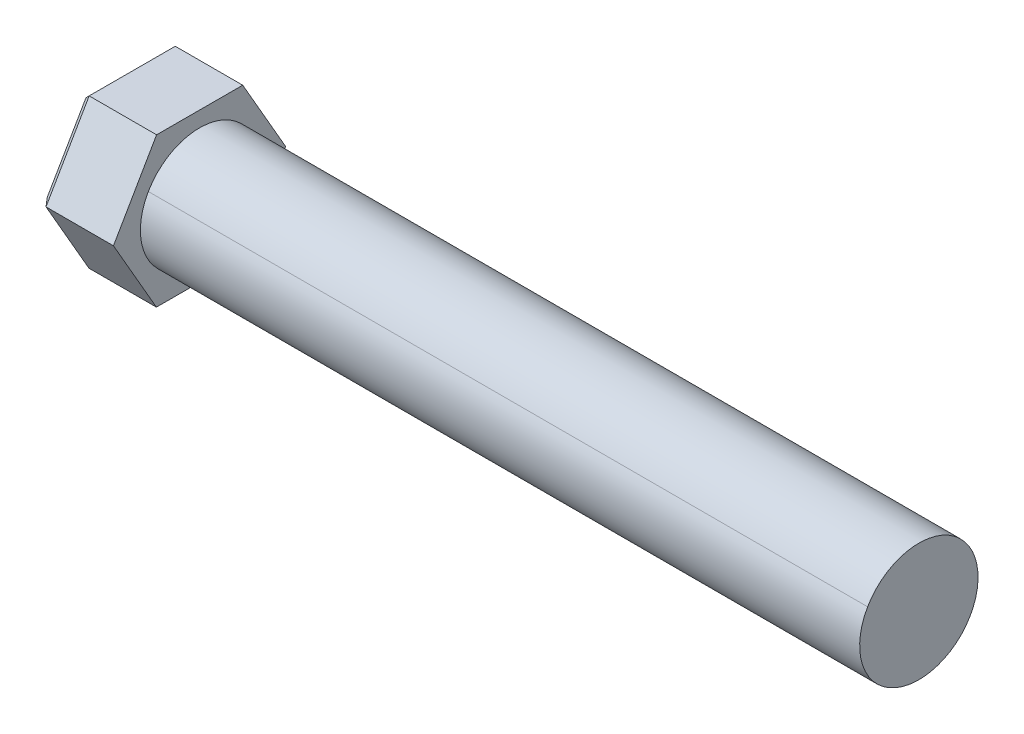
ISO-10303-21;
HEADER;
FILE_DESCRIPTION(('STEP AP214'),'2;1');
FILE_NAME('part.step','',(''),(''),'','','');
FILE_SCHEMA(('AUTOMOTIVE_DESIGN { 1 0 10303 214 1 1 1 1 }'));
ENDSEC;
DATA;
#1=APPLICATION_CONTEXT('core data for automotive mechanical design processes');
#2=APPLICATION_PROTOCOL_DEFINITION('international standard','automotive_design',2000,#1);
#3=PRODUCT_CONTEXT('',#1,'mechanical');
#4=PRODUCT('Part','Part','',(#3));
#5=PRODUCT_RELATED_PRODUCT_CATEGORY('part','',(#4));
#6=PRODUCT_DEFINITION_FORMATION('','',#4);
#7=PRODUCT_DEFINITION_CONTEXT('part definition',#1,'design');
#8=PRODUCT_DEFINITION('design','',#6,#7);
#9=PRODUCT_DEFINITION_SHAPE('','',#8);
#10=(LENGTH_UNIT() NAMED_UNIT(*) SI_UNIT(.MILLI.,.METRE.));
#11=(NAMED_UNIT(*) PLANE_ANGLE_UNIT() SI_UNIT($,.RADIAN.));
#12=(NAMED_UNIT(*) SI_UNIT($,.STERADIAN.) SOLID_ANGLE_UNIT());
#13=UNCERTAINTY_MEASURE_WITH_UNIT(LENGTH_MEASURE(1.E-05),#10,'distance_accuracy_value','');
#14=(GEOMETRIC_REPRESENTATION_CONTEXT(3) GLOBAL_UNCERTAINTY_ASSIGNED_CONTEXT((#13)) GLOBAL_UNIT_ASSIGNED_CONTEXT((#10,
#11,#12)) REPRESENTATION_CONTEXT('',''));
#15=CARTESIAN_POINT('',(0.,0.,0.));
#16=DIRECTION('',(0.,0.,1.));
#17=DIRECTION('',(1.,0.,0.));
#18=AXIS2_PLACEMENT_3D('',#15,#16,#17);
#19=CARTESIAN_POINT('',(-26.156988266467,-30.1298061957479,65.2729295398563));
#20=DIRECTION('',(0.707106781186545,-0.352872339014684,0.612765136376336));
#21=DIRECTION('',(0.,-0.86658076641281,-0.499036847620882));
#22=AXIS2_PLACEMENT_3D('',#19,#20,#21);
#23=PLANE('',#22);
#24=DIRECTION('',(0.65465367070798,0.654233046810696,-0.378692080573864));
#25=VECTOR('',#24,1.);
#26=CARTESIAN_POINT('',(-26.7966473512185,-28.5288117977138,66.9330336385893));
#27=LINE('',#26,#25);
#28=CARTESIAN_POINT('',(-26.156988266467,-27.889563702634,66.5630153518202));
#29=VERTEX_POINT('',#28);
#30=CARTESIAN_POINT('',(-25.656988266467,-27.389884959442,66.2737844977685));
#31=VERTEX_POINT('',#30);
#32=EDGE_CURVE('E25',#29,#31,#27,.T.);
#33=ORIENTED_EDGE('',*,*,#32,.T.);
#34=DIRECTION('',(0.,0.86658076641281,0.499036847620882));
#35=VECTOR('',#34,1.);
#36=CARTESIAN_POINT('',(-25.656988266467,-27.389884959442,66.2737844977685));
#37=LINE('',#36,#35);
#38=CARTESIAN_POINT('',(-25.656988266467,-32.3706905844329,63.4054938155313));
#39=VERTEX_POINT('',#38);
#40=EDGE_CURVE('E219',#39,#31,#37,.T.);
#41=ORIENTED_EDGE('',*,*,#40,.F.);
#42=DIRECTION('',(-0.65465367070798,0.000840438583602577,0.755928478820288));
#43=VECTOR('',#42,1.);
#44=CARTESIAN_POINT('',(-26.7966473512185,-32.3692275001949,64.721457960937));
#45=LINE('',#44,#43);
#46=CARTESIAN_POINT('',(-26.156988266467,-32.3700486888618,63.9828437278925));
#47=VERTEX_POINT('',#46);
#48=EDGE_CURVE('E11',#39,#47,#45,.T.);
#49=ORIENTED_EDGE('',*,*,#48,.T.);
#50=DIRECTION('',(0.,-0.86658076641281,-0.499036847620882));
#51=VECTOR('',#50,1.);
#52=CARTESIAN_POINT('',(-26.156988266467,-30.1298061957479,65.2729295398563));
#53=LINE('',#52,#51);
#54=EDGE_CURVE('E230',#29,#47,#53,.T.);
#55=ORIENTED_EDGE('',*,*,#54,.F.);
#56=EDGE_LOOP('',(#33,#41,#49,#55));
#57=FACE_BOUND('',#56,.T.);
#58=ADVANCED_FACE('F17',(#57),#23,.F.);
#59=CARTESIAN_POINT('',(-26.156988266467,-34.6074170216413,65.2779077315846));
#60=DIRECTION('',(0.707106781186545,0.354234005148001,0.61197897806772));
#61=DIRECTION('',(0.,-0.865468970670592,0.500962534334042));
#62=AXIS2_PLACEMENT_3D('',#59,#60,#61);
#63=PLANE('',#62);
#64=DIRECTION('',(-0.65465367070798,0.655073485394298,0.377236398246423));
#65=VECTOR('',#64,1.);
#66=CARTESIAN_POINT('',(-26.7966473512185,-36.204716070674,66.9415676815521));
#67=LINE('',#66,#65);
#68=CARTESIAN_POINT('',(-25.656988266467,-37.3451059931839,66.2848526769673));
#69=VERTEX_POINT('',#68);
#70=CARTESIAN_POINT('',(-26.156988266467,-36.8447853544209,66.5729717352767));
#71=VERTEX_POINT('',#70);
#72=EDGE_CURVE('E257',#69,#71,#67,.T.);
#73=ORIENTED_EDGE('',*,*,#72,.T.);
#74=DIRECTION('',(0.,-0.865468970670592,0.500962534334042));
#75=VECTOR('',#74,1.);
#76=CARTESIAN_POINT('',(-26.156988266467,-34.6074170216413,65.2779077315846));
#77=LINE('',#76,#75);
#78=EDGE_CURVE('E234',#47,#71,#77,.T.);
#79=ORIENTED_EDGE('',*,*,#78,.F.);
#80=ORIENTED_EDGE('',*,*,#48,.F.);
#81=DIRECTION('',(0.,0.865468970670592,-0.500962534334042));
#82=VECTOR('',#81,1.);
#83=CARTESIAN_POINT('',(-25.656988266467,-32.3706905844329,63.4054938155313));
#84=LINE('',#83,#82);
#85=EDGE_CURVE('E208',#69,#39,#84,.T.);
#86=ORIENTED_EDGE('',*,*,#85,.F.);
#87=EDGE_LOOP('',(#73,#79,#80,#86));
#88=FACE_BOUND('',#87,.T.);
#89=ADVANCED_FACE('F287',(#88),#63,.F.);
#90=CARTESIAN_POINT('',(-26.156988266467,-27.8866895422995,69.1481651674761));
#91=DIRECTION('',(0.707106781186545,-0.707106344162685,0.000786158308616413));
#92=DIRECTION('',(0.,-0.00111179574221762,-0.999999381954923));
#93=AXIS2_PLACEMENT_3D('',#90,#91,#92);
#94=PLANE('',#93);
#95=DIRECTION('',(0.65465367070798,0.655073485394298,0.377236398246423));
#96=VECTOR('',#95,1.);
#97=CARTESIAN_POINT('',(-26.7966473512185,-28.523884665712,71.3647190368567));
#98=LINE('',#97,#96);
#99=CARTESIAN_POINT('',(-26.156988266467,-27.8838153819651,71.7333149831321));
#100=VERTEX_POINT('',#99);
#101=CARTESIAN_POINT('',(-25.656988266467,-27.3834947432021,72.0214340414416));
#102=VERTEX_POINT('',#101);
#103=EDGE_CURVE('E254',#100,#102,#98,.T.);
#104=ORIENTED_EDGE('',*,*,#103,.T.);
#105=DIRECTION('',(0.,0.0011117957422177,0.999999381954923));
#106=VECTOR('',#105,1.);
#107=CARTESIAN_POINT('',(-25.656988266467,-27.3834947432021,72.0214340414416));
#108=LINE('',#107,#106);
#109=EDGE_CURVE('E158',#31,#102,#108,.T.);
#110=ORIENTED_EDGE('',*,*,#109,.F.);
#111=ORIENTED_EDGE('',*,*,#32,.F.);
#112=DIRECTION('',(0.,-0.0011117957422177,-0.999999381954923));
#113=VECTOR('',#112,1.);
#114=CARTESIAN_POINT('',(-26.156988266467,-27.8866895422995,69.1481651674761));
#115=LINE('',#114,#113);
#116=EDGE_CURVE('E226',#100,#29,#115,.T.);
#117=ORIENTED_EDGE('',*,*,#116,.F.);
#118=EDGE_LOOP('',(#104,#110,#111,#117));
#119=FACE_BOUND('',#118,.T.);
#120=ADVANCED_FACE('F271',(#119),#94,.F.);
#121=CARTESIAN_POINT('',(-26.156988266467,-36.8419111940865,69.1581215509327));
#122=DIRECTION('',(0.707106781186545,0.707106344162685,-0.00078615830861645));
#123=DIRECTION('',(0.,-0.00111179574221767,-0.999999381954923));
#124=AXIS2_PLACEMENT_3D('',#121,#122,#123);
#125=PLANE('',#124);
#126=DIRECTION('',(-0.65465367070798,0.654233046810696,-0.378692080573864));
#127=VECTOR('',#126,1.);
#128=CARTESIAN_POINT('',(-26.7966473512185,-36.1997889386722,71.3732530798195));
#129=LINE('',#128,#127);
#130=CARTESIAN_POINT('',(-25.656988266467,-37.338715776944,72.0325022206404));
#131=VERTEX_POINT('',#130);
#132=CARTESIAN_POINT('',(-26.156988266467,-36.8390370337521,71.7432713665887));
#133=VERTEX_POINT('',#132);
#134=EDGE_CURVE('E46',#131,#133,#129,.T.);
#135=ORIENTED_EDGE('',*,*,#134,.T.);
#136=DIRECTION('',(0.,0.0011117957422177,0.999999381954923));
#137=VECTOR('',#136,1.);
#138=CARTESIAN_POINT('',(-26.156988266467,-36.8419111940865,69.1581215509327));
#139=LINE('',#138,#137);
#140=EDGE_CURVE('E238',#71,#133,#139,.T.);
#141=ORIENTED_EDGE('',*,*,#140,.F.);
#142=ORIENTED_EDGE('',*,*,#72,.F.);
#143=DIRECTION('',(0.,-0.00111179574221759,-0.999999381954923));
#144=VECTOR('',#143,1.);
#145=CARTESIAN_POINT('',(-25.656988266467,-37.3451059931839,66.2848526769673));
#146=LINE('',#145,#144);
#147=EDGE_CURVE('E197',#131,#69,#146,.T.);
#148=ORIENTED_EDGE('',*,*,#147,.F.);
#149=EDGE_LOOP('',(#135,#141,#142,#148));
#150=FACE_BOUND('',#149,.T.);
#151=ADVANCED_FACE('F300',(#150),#125,.F.);
#152=CARTESIAN_POINT('',(-26.156988266467,-30.1211837147447,73.0283789868242));
#153=DIRECTION('',(0.707106781186545,-0.354234005148001,-0.61197897806772));
#154=DIRECTION('',(0.,-0.865468970670592,0.500962534334041));
#155=AXIS2_PLACEMENT_3D('',#152,#153,#154);
#156=PLANE('',#155);
#157=DIRECTION('',(0.65465367070798,0.000840438583601809,0.755928478820288));
#158=VECTOR('',#157,1.);
#159=CARTESIAN_POINT('',(-26.7966473512185,-32.3593732361912,73.5848287574718));
#160=LINE('',#159,#158);
#161=CARTESIAN_POINT('',(-26.156988266467,-32.3585520475242,74.3234429905164));
#162=VERTEX_POINT('',#161);
#163=CARTESIAN_POINT('',(-25.656988266467,-32.3579101519531,74.9007929028775));
#164=VERTEX_POINT('',#163);
#165=EDGE_CURVE('E36',#162,#164,#160,.T.);
#166=ORIENTED_EDGE('',*,*,#165,.T.);
#167=DIRECTION('',(0.,-0.865468970670592,0.500962534334042));
#168=VECTOR('',#167,1.);
#169=CARTESIAN_POINT('',(-25.656988266467,-32.3579101519531,74.9007929028775));
#170=LINE('',#169,#168);
#171=EDGE_CURVE('E165',#102,#164,#170,.T.);
#172=ORIENTED_EDGE('',*,*,#171,.F.);
#173=ORIENTED_EDGE('',*,*,#103,.F.);
#174=DIRECTION('',(0.,0.865468970670592,-0.500962534334042));
#175=VECTOR('',#174,1.);
#176=CARTESIAN_POINT('',(-26.156988266467,-30.1211837147447,73.0283789868242));
#177=LINE('',#176,#175);
#178=EDGE_CURVE('E246',#162,#100,#177,.T.);
#179=ORIENTED_EDGE('',*,*,#178,.F.);
#180=EDGE_LOOP('',(#166,#172,#173,#179));
#181=FACE_BOUND('',#180,.T.);
#182=ADVANCED_FACE('F292',(#181),#156,.F.);
#183=CARTESIAN_POINT('',(-26.156988266467,-34.5987945406382,73.0333571785525));
#184=DIRECTION('',(0.707106781186545,0.352872339014684,-0.612765136376336));
#185=DIRECTION('',(0.,-0.86658076641281,-0.499036847620881));
#186=AXIS2_PLACEMENT_3D('',#183,#184,#185);
#187=PLANE('',#186);
#188=ORIENTED_EDGE('',*,*,#134,.F.);
#189=DIRECTION('',(0.,-0.86658076641281,-0.499036847620882));
#190=VECTOR('',#189,1.);
#191=CARTESIAN_POINT('',(-25.656988266467,-37.338715776944,72.0325022206404));
#192=LINE('',#191,#190);
#193=EDGE_CURVE('E186',#164,#131,#192,.T.);
#194=ORIENTED_EDGE('',*,*,#193,.F.);
#195=ORIENTED_EDGE('',*,*,#165,.F.);
#196=DIRECTION('',(0.,0.86658076641281,0.499036847620882));
#197=VECTOR('',#196,1.);
#198=CARTESIAN_POINT('',(-26.156988266467,-34.5987945406382,73.0333571785525));
#199=LINE('',#198,#197);
#200=EDGE_CURVE('E242',#133,#162,#199,.T.);
#201=ORIENTED_EDGE('',*,*,#200,.F.);
#202=EDGE_LOOP('',(#188,#194,#195,#201));
#203=FACE_BOUND('',#202,.T.);
#204=ADVANCED_FACE('F308',(#203),#187,.F.);
#205=CARTESIAN_POINT('',(-26.156988266467,-32.364300368193,69.1531433592044));
#206=DIRECTION('',(-1.,0.,0.));
#207=DIRECTION('',(0.,1.,0.));
#208=AXIS2_PLACEMENT_3D('',#205,#206,#207);
#209=PLANE('',#208);
#210=ORIENTED_EDGE('',*,*,#116,.T.);
#211=ORIENTED_EDGE('',*,*,#54,.T.);
#212=ORIENTED_EDGE('',*,*,#78,.T.);
#213=ORIENTED_EDGE('',*,*,#140,.T.);
#214=ORIENTED_EDGE('',*,*,#200,.T.);
#215=ORIENTED_EDGE('',*,*,#178,.T.);
#216=EDGE_LOOP('',(#210,#211,#212,#213,#214,#215));
#217=FACE_BOUND('',#216,.T.);
#218=ADVANCED_FACE('F290',(#217),#209,.T.);
#219=CARTESIAN_POINT('',(-21.156988266467,-32.364300368193,69.1531433592044));
#220=DIRECTION('',(-1.,0.,0.));
#221=DIRECTION('',(0.,1.,0.));
#222=AXIS2_PLACEMENT_3D('',#219,#220,#221);
#223=PLANE('',#222);
#224=CARTESIAN_POINT('',(-21.156988266467,-32.364300368193,69.1531433592044));
#225=DIRECTION('',(-1.,0.,0.));
#226=DIRECTION('',(0.,0.500962534334042,0.865468970670592));
#227=AXIS2_PLACEMENT_3D('',#224,#225,#226);
#228=CIRCLE('',#227,3.95);
#229=CARTESIAN_POINT('',(-21.156988266467,-34.3431023788125,65.7345409250556));
#230=VERTEX_POINT('',#229);
#231=CARTESIAN_POINT('',(-21.156988266467,-30.3854983575735,72.5717457933533));
#232=VERTEX_POINT('',#231);
#233=EDGE_CURVE('E126',#230,#232,#228,.T.);
#234=ORIENTED_EDGE('',*,*,#233,.T.);
#235=CARTESIAN_POINT('',(-21.156988266467,-32.364300368193,69.1531433592044));
#236=DIRECTION('',(-1.,0.,0.));
#237=DIRECTION('',(0.,0.500962534334042,0.865468970670592));
#238=AXIS2_PLACEMENT_3D('',#235,#236,#237);
#239=CIRCLE('',#238,3.95);
#240=EDGE_CURVE('E131',#232,#230,#239,.T.);
#241=ORIENTED_EDGE('',*,*,#240,.T.);
#242=EDGE_LOOP('',(#234,#241));
#243=FACE_BOUND('',#242,.T.);
#244=DIRECTION('',(0.,-0.0011117957422177,-0.999999381954923));
#245=VECTOR('',#244,1.);
#246=CARTESIAN_POINT('',(-21.156988266467,-27.3834947432021,72.0214340414416));
#247=LINE('',#246,#245);
#248=CARTESIAN_POINT('',(-21.156988266467,-27.3834947432021,72.0214340414416));
#249=VERTEX_POINT('',#248);
#250=CARTESIAN_POINT('',(-21.156988266467,-27.389884959442,66.2737844977685));
#251=VERTEX_POINT('',#250);
#252=EDGE_CURVE('E157',#249,#251,#247,.T.);
#253=ORIENTED_EDGE('',*,*,#252,.F.);
#254=DIRECTION('',(0.,0.865468970670592,-0.500962534334042));
#255=VECTOR('',#254,1.);
#256=CARTESIAN_POINT('',(-21.156988266467,-32.3579101519531,74.9007929028775));
#257=LINE('',#256,#255);
#258=CARTESIAN_POINT('',(-21.156988266467,-32.3579101519531,74.9007929028775));
#259=VERTEX_POINT('',#258);
#260=EDGE_CURVE('E173',#259,#249,#257,.T.);
#261=ORIENTED_EDGE('',*,*,#260,.F.);
#262=DIRECTION('',(0.,0.86658076641281,0.499036847620881));
#263=VECTOR('',#262,1.);
#264=CARTESIAN_POINT('',(-21.156988266467,-37.338715776944,72.0325022206404));
#265=LINE('',#264,#263);
#266=CARTESIAN_POINT('',(-21.156988266467,-37.338715776944,72.0325022206404));
#267=VERTEX_POINT('',#266);
#268=EDGE_CURVE('E194',#267,#259,#265,.T.);
#269=ORIENTED_EDGE('',*,*,#268,.F.);
#270=DIRECTION('',(0.,0.00111179574221765,0.999999381954923));
#271=VECTOR('',#270,1.);
#272=CARTESIAN_POINT('',(-21.156988266467,-37.3451059931839,66.2848526769673));
#273=LINE('',#272,#271);
#274=CARTESIAN_POINT('',(-21.156988266467,-37.3451059931839,66.2848526769673));
#275=VERTEX_POINT('',#274);
#276=EDGE_CURVE('E205',#275,#267,#273,.T.);
#277=ORIENTED_EDGE('',*,*,#276,.F.);
#278=DIRECTION('',(0.,-0.865468970670592,0.500962534334042));
#279=VECTOR('',#278,1.);
#280=CARTESIAN_POINT('',(-21.156988266467,-32.3706905844329,63.4054938155313));
#281=LINE('',#280,#279);
#282=CARTESIAN_POINT('',(-21.156988266467,-32.3706905844329,63.4054938155313));
#283=VERTEX_POINT('',#282);
#284=EDGE_CURVE('E216',#283,#275,#281,.T.);
#285=ORIENTED_EDGE('',*,*,#284,.F.);
#286=DIRECTION('',(0.,-0.86658076641281,-0.499036847620881));
#287=VECTOR('',#286,1.);
#288=CARTESIAN_POINT('',(-21.156988266467,-27.389884959442,66.2737844977685));
#289=LINE('',#288,#287);
#290=EDGE_CURVE('E223',#251,#283,#289,.T.);
#291=ORIENTED_EDGE('',*,*,#290,.F.);
#292=EDGE_LOOP('',(#253,#261,#269,#277,#285,#291));
#293=FACE_BOUND('',#292,.T.);
#294=ADVANCED_FACE('F128',(#243,#293),#223,.F.);
#295=CARTESIAN_POINT('',(-21.156988266467,-27.389884959442,66.2737844977685));
#296=DIRECTION('',(0.,0.499036847620882,-0.86658076641281));
#297=DIRECTION('',(-1.,0.,0.));
#298=AXIS2_PLACEMENT_3D('',#295,#296,#297);
#299=PLANE('',#298);
#300=DIRECTION('',(-1.,0.,0.));
#301=VECTOR('',#300,1.);
#302=CARTESIAN_POINT('',(-21.156988266467,-32.3706905844329,63.4054938155313));
#303=LINE('',#302,#301);
#304=EDGE_CURVE('E212',#283,#39,#303,.T.);
#305=ORIENTED_EDGE('',*,*,#304,.T.);
#306=ORIENTED_EDGE('',*,*,#40,.T.);
#307=DIRECTION('',(-1.,0.,0.));
#308=VECTOR('',#307,1.);
#309=CARTESIAN_POINT('',(-21.156988266467,-27.389884959442,66.2737844977685));
#310=LINE('',#309,#308);
#311=EDGE_CURVE('E160',#251,#31,#310,.T.);
#312=ORIENTED_EDGE('',*,*,#311,.F.);
#313=ORIENTED_EDGE('',*,*,#290,.T.);
#314=EDGE_LOOP('',(#305,#306,#312,#313));
#315=FACE_BOUND('',#314,.T.);
#316=ADVANCED_FACE('F269',(#315),#299,.T.);
#317=CARTESIAN_POINT('',(-21.156988266467,-32.3706905844329,63.4054938155313));
#318=DIRECTION('',(0.,-0.500962534334042,-0.865468970670592));
#319=DIRECTION('',(0.,-0.865468970670592,0.500962534334041));
#320=AXIS2_PLACEMENT_3D('',#317,#318,#319);
#321=PLANE('',#320);
#322=DIRECTION('',(-1.,0.,0.));
#323=VECTOR('',#322,1.);
#324=CARTESIAN_POINT('',(-21.156988266467,-37.3451059931839,66.2848526769673));
#325=LINE('',#324,#323);
#326=EDGE_CURVE('E201',#275,#69,#325,.T.);
#327=ORIENTED_EDGE('',*,*,#326,.T.);
#328=ORIENTED_EDGE('',*,*,#85,.T.);
#329=ORIENTED_EDGE('',*,*,#304,.F.);
#330=ORIENTED_EDGE('',*,*,#284,.T.);
#331=EDGE_LOOP('',(#327,#328,#329,#330));
#332=FACE_BOUND('',#331,.T.);
#333=ADVANCED_FACE('F284',(#332),#321,.T.);
#334=CARTESIAN_POINT('',(-21.156988266467,-37.3451059931839,66.2848526769673));
#335=DIRECTION('',(0.,-0.999999381954923,0.00111179574221759));
#336=DIRECTION('',(-1.,0.,0.));
#337=AXIS2_PLACEMENT_3D('',#334,#335,#336);
#338=PLANE('',#337);
#339=DIRECTION('',(-1.,0.,0.));
#340=VECTOR('',#339,1.);
#341=CARTESIAN_POINT('',(-21.156988266467,-37.338715776944,72.0325022206404));
#342=LINE('',#341,#340);
#343=EDGE_CURVE('E190',#267,#131,#342,.T.);
#344=ORIENTED_EDGE('',*,*,#343,.T.);
#345=ORIENTED_EDGE('',*,*,#147,.T.);
#346=ORIENTED_EDGE('',*,*,#326,.F.);
#347=ORIENTED_EDGE('',*,*,#276,.T.);
#348=EDGE_LOOP('',(#344,#345,#346,#347));
#349=FACE_BOUND('',#348,.T.);
#350=ADVANCED_FACE('F299',(#349),#338,.T.);
#351=CARTESIAN_POINT('',(-21.156988266467,-37.338715776944,72.0325022206404));
#352=DIRECTION('',(0.,-0.499036847620882,0.86658076641281));
#353=DIRECTION('',(-1.,0.,0.));
#354=AXIS2_PLACEMENT_3D('',#351,#352,#353);
#355=PLANE('',#354);
#356=DIRECTION('',(-1.,0.,0.));
#357=VECTOR('',#356,1.);
#358=CARTESIAN_POINT('',(-21.156988266467,-32.3579101519531,74.9007929028775));
#359=LINE('',#358,#357);
#360=EDGE_CURVE('E170',#259,#164,#359,.T.);
#361=ORIENTED_EDGE('',*,*,#360,.T.);
#362=ORIENTED_EDGE('',*,*,#193,.T.);
#363=ORIENTED_EDGE('',*,*,#343,.F.);
#364=ORIENTED_EDGE('',*,*,#268,.T.);
#365=EDGE_LOOP('',(#361,#362,#363,#364));
#366=FACE_BOUND('',#365,.T.);
#367=ADVANCED_FACE('F296',(#366),#355,.T.);
#368=CARTESIAN_POINT('',(-21.156988266467,-32.3579101519531,74.9007929028775));
#369=DIRECTION('',(0.,0.500962534334042,0.865468970670592));
#370=DIRECTION('',(1.,0.,0.));
#371=AXIS2_PLACEMENT_3D('',#368,#369,#370);
#372=PLANE('',#371);
#373=DIRECTION('',(-1.,0.,0.));
#374=VECTOR('',#373,1.);
#375=CARTESIAN_POINT('',(-21.156988266467,-27.3834947432021,72.0214340414416));
#376=LINE('',#375,#374);
#377=EDGE_CURVE('E154',#249,#102,#376,.T.);
#378=ORIENTED_EDGE('',*,*,#377,.T.);
#379=ORIENTED_EDGE('',*,*,#171,.T.);
#380=ORIENTED_EDGE('',*,*,#360,.F.);
#381=ORIENTED_EDGE('',*,*,#260,.T.);
#382=EDGE_LOOP('',(#378,#379,#380,#381));
#383=FACE_BOUND('',#382,.T.);
#384=ADVANCED_FACE('F294',(#383),#372,.T.);
#385=CARTESIAN_POINT('',(-21.156988266467,-27.3834947432021,72.0214340414416));
#386=DIRECTION('',(0.,0.999999381954923,-0.0011117957422177));
#387=DIRECTION('',(-1.,0.,0.));
#388=AXIS2_PLACEMENT_3D('',#385,#386,#387);
#389=PLANE('',#388);
#390=ORIENTED_EDGE('',*,*,#311,.T.);
#391=ORIENTED_EDGE('',*,*,#109,.T.);
#392=ORIENTED_EDGE('',*,*,#377,.F.);
#393=ORIENTED_EDGE('',*,*,#252,.T.);
#394=EDGE_LOOP('',(#390,#391,#392,#393));
#395=FACE_BOUND('',#394,.T.);
#396=ADVANCED_FACE('F275',(#395),#389,.T.);
#397=CARTESIAN_POINT('',(26.843011733533,-32.364300368193,69.1531433592044));
#398=DIRECTION('',(-1.,0.,0.));
#399=DIRECTION('',(0.,1.,0.));
#400=AXIS2_PLACEMENT_3D('',#397,#398,#399);
#401=PLANE('',#400);
#402=CARTESIAN_POINT('',(26.843011733533,-32.364300368193,69.1531433592044));
#403=DIRECTION('',(-1.,0.,0.));
#404=DIRECTION('',(0.,0.500962534334042,0.865468970670592));
#405=AXIS2_PLACEMENT_3D('',#402,#403,#404);
#406=CIRCLE('',#405,3.95);
#407=CARTESIAN_POINT('',(26.843011733533,-34.3431023788125,65.7345409250556));
#408=VERTEX_POINT('',#407);
#409=CARTESIAN_POINT('',(26.843011733533,-30.3854983575735,72.5717457933533));
#410=VERTEX_POINT('',#409);
#411=EDGE_CURVE('E136',#408,#410,#406,.T.);
#412=ORIENTED_EDGE('',*,*,#411,.F.);
#413=CARTESIAN_POINT('',(26.843011733533,-32.364300368193,69.1531433592044));
#414=DIRECTION('',(-1.,0.,0.));
#415=DIRECTION('',(0.,0.500962534334042,0.865468970670592));
#416=AXIS2_PLACEMENT_3D('',#413,#414,#415);
#417=CIRCLE('',#416,3.95);
#418=EDGE_CURVE('E146',#410,#408,#417,.T.);
#419=ORIENTED_EDGE('',*,*,#418,.F.);
#420=EDGE_LOOP('',(#412,#419));
#421=FACE_BOUND('',#420,.T.);
#422=ADVANCED_FACE('F375',(#421),#401,.F.);
#423=CARTESIAN_POINT('',(-26.156988266467,-32.364300368193,69.1531433592044));
#424=DIRECTION('',(1.,0.,0.));
#425=DIRECTION('',(0.,-0.500962534334042,-0.865468970670592));
#426=AXIS2_PLACEMENT_3D('',#423,#424,#425);
#427=CYLINDRICAL_SURFACE('',#426,3.95);
#428=DIRECTION('',(1.,0.,0.));
#429=VECTOR('',#428,1.);
#430=CARTESIAN_POINT('',(-26.156988266467,-30.3854983575735,72.5717457933533));
#431=LINE('',#430,#429);
#432=EDGE_CURVE('E140',#232,#410,#431,.T.);
#433=ORIENTED_EDGE('',*,*,#432,.F.);
#434=ORIENTED_EDGE('',*,*,#233,.F.);
#435=DIRECTION('',(1.,0.,0.));
#436=VECTOR('',#435,1.);
#437=CARTESIAN_POINT('',(-26.156988266467,-34.3431023788125,65.7345409250556));
#438=LINE('',#437,#436);
#439=EDGE_CURVE('E137',#230,#408,#438,.T.);
#440=ORIENTED_EDGE('',*,*,#439,.T.);
#441=ORIENTED_EDGE('',*,*,#411,.T.);
#442=EDGE_LOOP('',(#433,#434,#440,#441));
#443=FACE_BOUND('',#442,.T.);
#444=ADVANCED_FACE('F141',(#443),#427,.T.);
#445=CARTESIAN_POINT('',(-26.156988266467,-32.364300368193,69.1531433592044));
#446=DIRECTION('',(1.,0.,0.));
#447=DIRECTION('',(0.,-0.500962534334042,-0.865468970670592));
#448=AXIS2_PLACEMENT_3D('',#445,#446,#447);
#449=CYLINDRICAL_SURFACE('',#448,3.95);
#450=ORIENTED_EDGE('',*,*,#240,.F.);
#451=ORIENTED_EDGE('',*,*,#432,.T.);
#452=ORIENTED_EDGE('',*,*,#418,.T.);
#453=ORIENTED_EDGE('',*,*,#439,.F.);
#454=EDGE_LOOP('',(#450,#451,#452,#453));
#455=FACE_BOUND('',#454,.T.);
#456=ADVANCED_FACE('F148',(#455),#449,.T.);
#457=CLOSED_SHELL('',(#58,#89,#120,#151,#182,#204,#218,#294,#316,#333,#350,#367,#384,#396,#422,
#444,#456));
#458=MANIFOLD_SOLID_BREP('B1',#457);
#459=ADVANCED_BREP_SHAPE_REPRESENTATION('',(#18,#458),#14);
#460=SHAPE_DEFINITION_REPRESENTATION(#9,#459);
ENDSEC;
END-ISO-10303-21;
